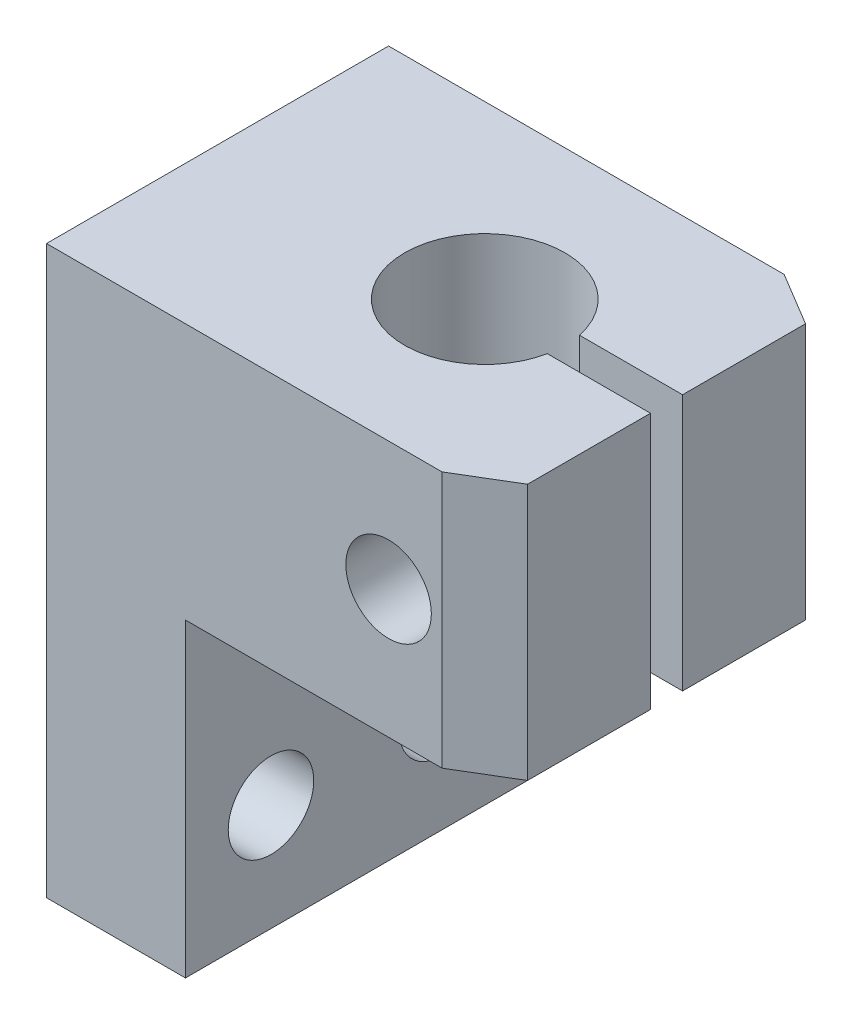
ISO-10303-21;
HEADER;
FILE_DESCRIPTION(('STEP AP214'),'2;1');
FILE_NAME('part.step','',(''),(''),'','','');
FILE_SCHEMA(('AUTOMOTIVE_DESIGN { 1 0 10303 214 1 1 1 1 }'));
ENDSEC;
DATA;
#1=APPLICATION_CONTEXT('core data for automotive mechanical design processes');
#2=APPLICATION_PROTOCOL_DEFINITION('international standard','automotive_design',2000,#1);
#3=PRODUCT_CONTEXT('',#1,'mechanical');
#4=PRODUCT('Part','Part','',(#3));
#5=PRODUCT_RELATED_PRODUCT_CATEGORY('part','',(#4));
#6=PRODUCT_DEFINITION_FORMATION('','',#4);
#7=PRODUCT_DEFINITION_CONTEXT('part definition',#1,'design');
#8=PRODUCT_DEFINITION('design','',#6,#7);
#9=PRODUCT_DEFINITION_SHAPE('','',#8);
#10=(LENGTH_UNIT() NAMED_UNIT(*) SI_UNIT(.MILLI.,.METRE.));
#11=(NAMED_UNIT(*) PLANE_ANGLE_UNIT() SI_UNIT($,.RADIAN.));
#12=(NAMED_UNIT(*) SI_UNIT($,.STERADIAN.) SOLID_ANGLE_UNIT());
#13=UNCERTAINTY_MEASURE_WITH_UNIT(LENGTH_MEASURE(1.E-05),#10,'distance_accuracy_value','');
#14=(GEOMETRIC_REPRESENTATION_CONTEXT(3) GLOBAL_UNCERTAINTY_ASSIGNED_CONTEXT((#13)) GLOBAL_UNIT_ASSIGNED_CONTEXT((#10,
#11,#12)) REPRESENTATION_CONTEXT('',''));
#15=CARTESIAN_POINT('',(0.,0.,0.));
#16=DIRECTION('',(0.,0.,1.));
#17=DIRECTION('',(1.,0.,0.));
#18=AXIS2_PLACEMENT_3D('',#15,#16,#17);
#19=CARTESIAN_POINT('',(42.,0.,32.));
#20=DIRECTION('',(1.,0.,0.));
#21=DIRECTION('',(0.,1.,0.));
#22=AXIS2_PLACEMENT_3D('',#19,#20,#21);
#23=PLANE('',#22);
#24=DIRECTION('',(0.,0.,-1.));
#25=VECTOR('',#24,1.);
#26=CARTESIAN_POINT('',(42.,-24.,32.));
#27=LINE('',#26,#25);
#28=CARTESIAN_POINT('',(42.,-24.,14.5));
#29=VERTEX_POINT('',#28);
#30=CARTESIAN_POINT('',(42.,-24.,3.00000000000002));
#31=VERTEX_POINT('',#30);
#32=EDGE_CURVE('E284',#29,#31,#27,.T.);
#33=ORIENTED_EDGE('',*,*,#32,.T.);
#34=DIRECTION('',(0.,1.,0.));
#35=VECTOR('',#34,1.);
#36=CARTESIAN_POINT('',(42.,0.,3.00000000000002));
#37=LINE('',#36,#35);
#38=CARTESIAN_POINT('',(42.,0.,3.00000000000002));
#39=VERTEX_POINT('',#38);
#40=EDGE_CURVE('E71',#31,#39,#37,.T.);
#41=ORIENTED_EDGE('',*,*,#40,.T.);
#42=DIRECTION('',(0.,0.,-1.));
#43=VECTOR('',#42,1.);
#44=CARTESIAN_POINT('',(42.,0.,32.));
#45=LINE('',#44,#43);
#46=CARTESIAN_POINT('',(42.,0.,14.5));
#47=VERTEX_POINT('',#46);
#48=EDGE_CURVE('E178',#47,#39,#45,.T.);
#49=ORIENTED_EDGE('',*,*,#48,.F.);
#50=DIRECTION('',(0.,-1.,0.));
#51=VECTOR('',#50,1.);
#52=CARTESIAN_POINT('',(42.,0.,14.5));
#53=LINE('',#52,#51);
#54=EDGE_CURVE('E211',#47,#29,#53,.T.);
#55=ORIENTED_EDGE('',*,*,#54,.T.);
#56=EDGE_LOOP('',(#33,#41,#49,#55));
#57=FACE_BOUND('',#56,.T.);
#58=ADVANCED_FACE('F61',(#57),#23,.T.);
#59=CARTESIAN_POINT('',(32.,-12.,32.));
#60=DIRECTION('',(0.,0.,-1.));
#61=DIRECTION('',(-1.,0.,0.));
#62=AXIS2_PLACEMENT_3D('',#59,#60,#61);
#63=CYLINDRICAL_SURFACE('',#62,4.00000000000001);
#64=CARTESIAN_POINT('',(32.,-12.,14.5));
#65=DIRECTION('',(0.,0.,-1.));
#66=DIRECTION('',(-1.,0.,0.));
#67=AXIS2_PLACEMENT_3D('',#64,#65,#66);
#68=CIRCLE('',#67,4.00000000000001);
#69=CARTESIAN_POINT('',(32.3484692283495,-8.01520775988339,14.5));
#70=VERTEX_POINT('',#69);
#71=CARTESIAN_POINT('',(32.3484692283495,-15.9847922401166,14.5));
#72=VERTEX_POINT('',#71);
#73=EDGE_CURVE('E381',#70,#72,#68,.T.);
#74=ORIENTED_EDGE('',*,*,#73,.F.);
#75=CARTESIAN_POINT('',(32.3484692283495,-15.9847922401166,14.5));
#76=CARTESIAN_POINT('',(32.3279476400915,-15.9865821315345,14.3994665723361));
#77=CARTESIAN_POINT('',(32.3053657332151,-15.9884024120403,14.2993666923016));
#78=CARTESIAN_POINT('',(32.2561134041222,-15.9918695870414,14.1001714854958));
#79=CARTESIAN_POINT('',(32.2294428496215,-15.9935164759238,14.0010761913375));
#80=CARTESIAN_POINT('',(32.1432959822248,-15.9978482435656,13.7053324938304));
#81=CARTESIAN_POINT('',(32.0777222026807,-15.9999200822324,13.5104111079246));
#82=CARTESIAN_POINT('',(31.9301397719995,-16.0000760764122,13.124907489344));
#83=CARTESIAN_POINT('',(31.8479895682176,-15.9981244518403,12.9343795587296));
#84=CARTESIAN_POINT('',(31.6682984929271,-15.9872385825846,12.5610099904932));
#85=CARTESIAN_POINT('',(31.5707676359628,-15.9783088665667,12.3781634488462));
#86=CARTESIAN_POINT('',(31.3916584924338,-15.9541804472491,12.0733880928686));
#87=CARTESIAN_POINT('',(31.3136403135395,-15.9415462288422,11.9491527724457));
#88=CARTESIAN_POINT('',(31.1508651239433,-15.9097120428309,11.7060222324002));
#89=CARTESIAN_POINT('',(31.0661082867479,-15.8905122442349,11.5871268754079));
#90=CARTESIAN_POINT('',(30.8909609053164,-15.8442426880015,11.3559146572445));
#91=CARTESIAN_POINT('',(30.8005946551388,-15.8172052294869,11.2435730258));
#92=CARTESIAN_POINT('',(30.6149430104995,-15.7538286794672,11.0257795233424));
#93=CARTESIAN_POINT('',(30.51965875391,-15.7174917319387,10.9203260712996));
#94=CARTESIAN_POINT('',(30.3452642721359,-15.6426545251765,10.7378049045736));
#95=CARTESIAN_POINT('',(30.2668001918166,-15.6060930093397,10.6593223787285));
#96=CARTESIAN_POINT('',(30.1084917940311,-15.5256313134716,10.507704058471));
#97=CARTESIAN_POINT('',(30.0286477910671,-15.4817327863696,10.4345670651045));
#98=CARTESIAN_POINT('',(29.8685642163748,-15.3861002552575,10.2940002628199));
#99=CARTESIAN_POINT('',(29.788324542329,-15.3343641092635,10.2265720219537));
#100=CARTESIAN_POINT('',(29.6286318043626,-15.2227473640042,10.0977724005209));
#101=CARTESIAN_POINT('',(29.5491787489496,-15.1628666767564,10.0364010853973));
#102=CARTESIAN_POINT('',(29.391823835788,-15.0344347958901,9.91957661339939));
#103=CARTESIAN_POINT('',(29.3139351810219,-14.9658304993785,9.86416390110497));
#104=CARTESIAN_POINT('',(29.1615804787105,-14.8203662458557,9.75982566325138));
#105=CARTESIAN_POINT('',(29.0871144982451,-14.7435061271395,9.71090026479973));
#106=CARTESIAN_POINT('',(28.9429508765934,-14.5818934420729,9.61952791628472));
#107=CARTESIAN_POINT('',(28.8732523896311,-14.497142281963,9.57707981546466));
#108=CARTESIAN_POINT('',(28.7398668727063,-14.3203004466739,9.49850858862854));
#109=CARTESIAN_POINT('',(28.6761792584055,-14.2282104865342,9.46238484750643));
#110=CARTESIAN_POINT('',(28.5625816862632,-14.0479794309192,9.39986813311078));
#111=CARTESIAN_POINT('',(28.5119269233741,-13.9605255512929,9.3728410833562));
#112=CARTESIAN_POINT('',(28.4169225160937,-13.7809754510231,9.32336075787554));
#113=CARTESIAN_POINT('',(28.3725750300503,-13.6888776557667,9.30090904669658));
#114=CARTESIAN_POINT('',(28.2908031611211,-13.5007901072137,9.26036366496484));
#115=CARTESIAN_POINT('',(28.2533754973961,-13.404802224748,9.24226792791412));
#116=CARTESIAN_POINT('',(28.1858666681025,-13.2095697781243,9.21018025127386));
#117=CARTESIAN_POINT('',(28.1557882439033,-13.1103240143417,9.1961898426395));
#118=CARTESIAN_POINT('',(28.1039861585091,-12.9117822983953,9.17240432716445));
#119=CARTESIAN_POINT('',(28.0820781571746,-12.8125455214018,9.16251600464993));
#120=CARTESIAN_POINT('',(28.0458442551581,-12.6123735833281,9.1462982574288));
#121=CARTESIAN_POINT('',(28.0315210847339,-12.5114378241483,9.1399701142036));
#122=CARTESIAN_POINT('',(28.0106236581338,-12.3086473590775,9.13077328055634));
#123=CARTESIAN_POINT('',(28.004046692872,-12.2067929870187,9.12790338067221));
#124=CARTESIAN_POINT('',(27.9986994331681,-12.0028029979972,9.12556836862707));
#125=CARTESIAN_POINT('',(27.9999320350765,-11.9006672907338,9.12610451967547));
#126=CARTESIAN_POINT('',(28.0102403127122,-11.696027884125,9.1306124535658));
#127=CARTESIAN_POINT('',(28.0193801895493,-11.5935280299697,9.13461235973973));
#128=CARTESIAN_POINT('',(28.0454976348554,-11.3896946788332,9.14615818027116));
#129=CARTESIAN_POINT('',(28.062478113179,-11.2883616292069,9.15370541115334));
#130=CARTESIAN_POINT('',(28.1040863365585,-11.0876656237564,9.17246985265354));
#131=CARTESIAN_POINT('',(28.1287109874344,-10.9883018880821,9.18368557845002));
#132=CARTESIAN_POINT('',(28.1853436136344,-10.7921839021378,9.20996610557116));
#133=CARTESIAN_POINT('',(28.2173542796494,-10.6954306172247,9.22503230982292));
#134=CARTESIAN_POINT('',(28.2883092554886,-10.5054764874334,9.25918647027361));
#135=CARTESIAN_POINT('',(28.3272379894529,-10.4122682217643,9.27826540924862));
#136=CARTESIAN_POINT('',(28.4115953074019,-10.2298368830611,9.32068516173467));
#137=CARTESIAN_POINT('',(28.4570262602754,-10.1406152780608,9.34402752935809));
#138=CARTESIAN_POINT('',(28.602201931666,-9.8800127344483,9.42078126730762));
#139=CARTESIAN_POINT('',(28.7109264541888,-9.71543833367862,9.48096334838627));
#140=CARTESIAN_POINT('',(28.9454529820933,-9.41029464234405,9.62020507186028));
#141=CARTESIAN_POINT('',(29.0711206564342,-9.26955441633084,9.69911960545421));
#142=CARTESIAN_POINT('',(29.3334137977663,-9.01286171227122,9.87655745136913));
#143=CARTESIAN_POINT('',(29.470040605079,-8.89691227255793,9.97508316436192));
#144=CARTESIAN_POINT('',(29.7521223875051,-8.68652213265695,10.1947965275146));
#145=CARTESIAN_POINT('',(29.8977187046296,-8.59298672331326,10.3166621909539));
#146=CARTESIAN_POINT('',(30.1862407042122,-8.43100968624096,10.5786647998982));
#147=CARTESIAN_POINT('',(30.3291662164998,-8.36256965232623,10.7188029051249));
#148=CARTESIAN_POINT('',(30.5690985129632,-8.26308934281292,10.9743635461632));
#149=CARTESIAN_POINT('',(30.6679992522649,-8.22693971751003,11.0861056000708));
#150=CARTESIAN_POINT('',(30.8601986595844,-8.16449967986145,11.3169858928861));
#151=CARTESIAN_POINT('',(30.9534951552781,-8.1382130701807,11.4361269638782));
#152=CARTESIAN_POINT('',(31.1337300622374,-8.09382111859771,11.6813628558948));
#153=CARTESIAN_POINT('',(31.2206389382708,-8.07575199416157,11.8074857638046));
#154=CARTESIAN_POINT('',(31.3868922993155,-8.04636562861496,12.0653895233106));
#155=CARTESIAN_POINT('',(31.4662349535431,-8.03505001817347,12.1971717331458));
#156=CARTESIAN_POINT('',(31.6365109240973,-8.01540070647246,12.5007964141958));
#157=CARTESIAN_POINT('',(31.7250381772559,-8.00862394990282,12.6740920772447));
#158=CARTESIAN_POINT('',(31.8884139135577,-8.00072021162165,13.027184068018));
#159=CARTESIAN_POINT('',(31.9632564489941,-7.99959568090533,13.2069831818257));
#160=CARTESIAN_POINT('',(32.098104528989,-8.00063962553631,13.5701698068444));
#161=CARTESIAN_POINT('',(32.1582410981558,-8.00277769151055,13.7535086455892));
#162=CARTESIAN_POINT('',(32.2376857127742,-8.00698084200948,14.0314497120808));
#163=CARTESIAN_POINT('',(32.2623678420135,-8.00854725562985,14.1245559734324));
#164=CARTESIAN_POINT('',(32.3081282379957,-8.01182028272979,14.3116477385582));
#165=CARTESIAN_POINT('',(32.3292064982884,-8.01352689646029,14.4056332439058));
#166=CARTESIAN_POINT('',(32.3484692283495,-8.01520775988339,14.5));
#167=B_SPLINE_CURVE_WITH_KNOTS('',3,(#75,#76,#77,#78,#79,#80,#81,#82,#83,#84,#85,#86,#87,#88,
#89,#90,#91,#92,#93,#94,#95,#96,#97,#98,#99,#100,#101,#102,#103,#104,#105,#106,#107,#108,#109,
#110,#111,#112,#113,#114,#115,#116,#117,#118,#119,#120,#121,#122,#123,#124,#125,#126,#127,#128,
#129,#130,#131,#132,#133,#134,#135,#136,#137,#138,#139,#140,#141,#142,#143,#144,#145,#146,#147,
#148,#149,#150,#151,#152,#153,#154,#155,#156,#157,#158,#159,#160,#161,#162,#163,#164,#165,#166),
.UNSPECIFIED.,.F.,.F.,(4,2,2,2,2,2,2,2,2,2,2,2,2,2,2,2,2,2,2,2,2,2,2,2,2,2,2,2,2,2,2,2,2,2,2,2,
2,2,2,2,2,2,2,2,2,4),(0.,0.307820468171958,0.615650897689144,1.23187610446544,1.85360494582323,
2.47493063020902,2.91631674026319,3.35769148920617,3.79727257347161,4.23675240445192,
4.58696116107485,4.93709112648953,5.28731695396195,5.63754656509442,5.99002049794918,
6.34250133589125,6.69491947899599,7.0473033269127,7.36076758516049,7.67433885400046,
7.98776106843954,8.30130001588611,8.60726177200562,8.91333358827266,9.21929833000608,
9.52537655216129,9.83396347265568,10.1426650100831,10.451241755009,10.7599310909813,
11.0679340281398,11.376049463949,11.9914599453893,12.6022504350502,13.2131157397059,
13.8455764463206,14.4780773137266,14.9381073417984,15.3983145516744,15.8605308608102,
16.3228587292312,16.9062612747948,17.489916781509,18.0681653974279,18.3571091180333,
18.6460533557904),.UNSPECIFIED.);
#168=EDGE_CURVE('E221',#72,#70,#167,.T.);
#169=ORIENTED_EDGE('',*,*,#168,.F.);
#170=EDGE_LOOP('',(#74,#169));
#171=FACE_BOUND('',#170,.T.);
#172=CARTESIAN_POINT('',(32.,-12.,0.));
#173=DIRECTION('',(0.,0.,1.));
#174=DIRECTION('',(1.,0.,0.));
#175=AXIS2_PLACEMENT_3D('',#172,#173,#174);
#176=CIRCLE('',#175,4.00000000000001);
#177=CARTESIAN_POINT('',(36.,-12.,0.));
#178=VERTEX_POINT('',#177);
#179=EDGE_CURVE('E314',#178,#178,#176,.T.);
#180=ORIENTED_EDGE('',*,*,#179,.F.);
#181=EDGE_LOOP('',(#180));
#182=FACE_BOUND('',#181,.T.);
#183=ADVANCED_FACE('F274',(#171,#182),#63,.F.);
#184=CARTESIAN_POINT('',(42.,0.,29.));
#185=VERTEX_POINT('',#184);
#186=CARTESIAN_POINT('',(42.,0.,17.5));
#187=VERTEX_POINT('',#186);
#188=EDGE_CURVE('E164',#185,#187,#45,.T.);
#189=ORIENTED_EDGE('',*,*,#188,.F.);
#190=DIRECTION('',(0.,-1.,0.));
#191=VECTOR('',#190,1.);
#192=CARTESIAN_POINT('',(42.,0.,29.));
#193=LINE('',#192,#191);
#194=CARTESIAN_POINT('',(42.,-24.,29.));
#195=VERTEX_POINT('',#194);
#196=EDGE_CURVE('E177',#185,#195,#193,.T.);
#197=ORIENTED_EDGE('',*,*,#196,.T.);
#198=CARTESIAN_POINT('',(42.,-24.,17.5));
#199=VERTEX_POINT('',#198);
#200=EDGE_CURVE('E195',#195,#199,#27,.T.);
#201=ORIENTED_EDGE('',*,*,#200,.T.);
#202=DIRECTION('',(0.,-1.,0.));
#203=VECTOR('',#202,1.);
#204=CARTESIAN_POINT('',(42.,0.,17.5));
#205=LINE('',#204,#203);
#206=EDGE_CURVE('E184',#187,#199,#205,.T.);
#207=ORIENTED_EDGE('',*,*,#206,.F.);
#208=EDGE_LOOP('',(#189,#197,#201,#207));
#209=FACE_BOUND('',#208,.T.);
#210=ADVANCED_FACE('F193',(#209),#23,.T.);
#211=CARTESIAN_POINT('',(0.,0.,32.));
#212=DIRECTION('',(0.,1.,0.));
#213=DIRECTION('',(0.,0.,1.));
#214=AXIS2_PLACEMENT_3D('',#211,#212,#213);
#215=PLANE('',#214);
#216=ORIENTED_EDGE('',*,*,#48,.T.);
#217=DIRECTION('',(-0.857492925712544,0.,-0.514495755427527));
#218=VECTOR('',#217,1.);
#219=CARTESIAN_POINT('',(23.9117647058824,0.,-7.85294117647058));
#220=LINE('',#219,#218);
#221=CARTESIAN_POINT('',(37.,0.,0.));
#222=VERTEX_POINT('',#221);
#223=EDGE_CURVE('E13',#39,#222,#220,.T.);
#224=ORIENTED_EDGE('',*,*,#223,.T.);
#225=DIRECTION('',(1.,0.,0.));
#226=VECTOR('',#225,1.);
#227=CARTESIAN_POINT('',(0.,0.,0.));
#228=LINE('',#227,#226);
#229=CARTESIAN_POINT('',(0.,0.,0.));
#230=VERTEX_POINT('',#229);
#231=EDGE_CURVE('E350',#230,#222,#228,.T.);
#232=ORIENTED_EDGE('',*,*,#231,.F.);
#233=DIRECTION('',(0.,0.,-1.));
#234=VECTOR('',#233,1.);
#235=CARTESIAN_POINT('',(0.,0.,32.));
#236=LINE('',#235,#234);
#237=CARTESIAN_POINT('',(0.,0.,32.));
#238=VERTEX_POINT('',#237);
#239=EDGE_CURVE('E320',#238,#230,#236,.T.);
#240=ORIENTED_EDGE('',*,*,#239,.F.);
#241=DIRECTION('',(1.,0.,0.));
#242=VECTOR('',#241,1.);
#243=CARTESIAN_POINT('',(0.,0.,32.));
#244=LINE('',#243,#242);
#245=CARTESIAN_POINT('',(37.,0.,32.));
#246=VERTEX_POINT('',#245);
#247=EDGE_CURVE('E371',#238,#246,#244,.T.);
#248=ORIENTED_EDGE('',*,*,#247,.T.);
#249=DIRECTION('',(-0.857492925712545,0.,0.514495755427525));
#250=VECTOR('',#249,1.);
#251=CARTESIAN_POINT('',(9.79411764705877,0.,48.3235294117647));
#252=LINE('',#251,#250);
#253=EDGE_CURVE('E171',#246,#185,#252,.F.);
#254=ORIENTED_EDGE('',*,*,#253,.T.);
#255=ORIENTED_EDGE('',*,*,#188,.T.);
#256=DIRECTION('',(-1.,0.,0.));
#257=VECTOR('',#256,1.);
#258=CARTESIAN_POINT('',(32.3484692283495,0.,17.5));
#259=LINE('',#258,#257);
#260=CARTESIAN_POINT('',(32.3484692283495,0.,17.5));
#261=VERTEX_POINT('',#260);
#262=EDGE_CURVE('E168',#187,#261,#259,.T.);
#263=ORIENTED_EDGE('',*,*,#262,.T.);
#264=CARTESIAN_POINT('',(25.,0.,16.));
#265=DIRECTION('',(0.,-1.,0.));
#266=DIRECTION('',(0.,0.,-1.));
#267=AXIS2_PLACEMENT_3D('',#264,#265,#266);
#268=CIRCLE('',#267,7.5);
#269=CARTESIAN_POINT('',(32.3484692283495,0.,14.5));
#270=VERTEX_POINT('',#269);
#271=EDGE_CURVE('E190',#261,#270,#268,.T.);
#272=ORIENTED_EDGE('',*,*,#271,.T.);
#273=DIRECTION('',(1.,0.,0.));
#274=VECTOR('',#273,1.);
#275=CARTESIAN_POINT('',(32.3484692283495,0.,14.5));
#276=LINE('',#275,#274);
#277=EDGE_CURVE('E198',#270,#47,#276,.T.);
#278=ORIENTED_EDGE('',*,*,#277,.T.);
#279=EDGE_LOOP('',(#216,#224,#232,#240,#248,#254,#255,#263,#272,#278));
#280=FACE_BOUND('',#279,.T.);
#281=ADVANCED_FACE('F166',(#280),#215,.T.);
#282=CARTESIAN_POINT('',(0.,0.,32.));
#283=DIRECTION('',(1.,0.,0.));
#284=DIRECTION('',(0.,0.,-1.));
#285=AXIS2_PLACEMENT_3D('',#282,#283,#284);
#286=PLANE('',#285);
#287=CARTESIAN_POINT('',(0.,-43.,8.));
#288=DIRECTION('',(-1.,0.,0.));
#289=DIRECTION('',(0.,0.,1.));
#290=AXIS2_PLACEMENT_3D('',#287,#288,#289);
#291=CIRCLE('',#290,4.);
#292=CARTESIAN_POINT('',(0.,-43.,12.));
#293=VERTEX_POINT('',#292);
#294=EDGE_CURVE('E318',#293,#293,#291,.T.);
#295=ORIENTED_EDGE('',*,*,#294,.F.);
#296=EDGE_LOOP('',(#295));
#297=FACE_BOUND('',#296,.T.);
#298=CARTESIAN_POINT('',(0.,-43.,24.));
#299=DIRECTION('',(-1.,0.,0.));
#300=DIRECTION('',(0.,0.,1.));
#301=AXIS2_PLACEMENT_3D('',#298,#299,#300);
#302=CIRCLE('',#301,4.00000000000001);
#303=CARTESIAN_POINT('',(0.,-43.,28.));
#304=VERTEX_POINT('',#303);
#305=EDGE_CURVE('E377',#304,#304,#302,.T.);
#306=ORIENTED_EDGE('',*,*,#305,.F.);
#307=EDGE_LOOP('',(#306));
#308=FACE_BOUND('',#307,.T.);
#309=DIRECTION('',(0.,-1.,0.));
#310=VECTOR('',#309,1.);
#311=CARTESIAN_POINT('',(0.,0.,0.));
#312=LINE('',#311,#310);
#313=CARTESIAN_POINT('',(0.,-53.,0.));
#314=VERTEX_POINT('',#313);
#315=EDGE_CURVE('E346',#230,#314,#312,.T.);
#316=ORIENTED_EDGE('',*,*,#315,.T.);
#317=DIRECTION('',(0.,0.,-1.));
#318=VECTOR('',#317,1.);
#319=CARTESIAN_POINT('',(0.,-53.,32.));
#320=LINE('',#319,#318);
#321=CARTESIAN_POINT('',(0.,-53.,32.));
#322=VERTEX_POINT('',#321);
#323=EDGE_CURVE('E323',#322,#314,#320,.T.);
#324=ORIENTED_EDGE('',*,*,#323,.F.);
#325=DIRECTION('',(0.,-1.,0.));
#326=VECTOR('',#325,1.);
#327=CARTESIAN_POINT('',(0.,0.,32.));
#328=LINE('',#327,#326);
#329=EDGE_CURVE('E367',#238,#322,#328,.T.);
#330=ORIENTED_EDGE('',*,*,#329,.F.);
#331=ORIENTED_EDGE('',*,*,#239,.T.);
#332=EDGE_LOOP('',(#316,#324,#330,#331));
#333=FACE_BOUND('',#332,.T.);
#334=ADVANCED_FACE('F267',(#297,#308,#333),#286,.F.);
#335=CARTESIAN_POINT('',(0.,-53.,32.));
#336=DIRECTION('',(0.,1.,0.));
#337=DIRECTION('',(0.,0.,1.));
#338=AXIS2_PLACEMENT_3D('',#335,#336,#337);
#339=PLANE('',#338);
#340=DIRECTION('',(1.,0.,0.));
#341=VECTOR('',#340,1.);
#342=CARTESIAN_POINT('',(0.,-53.,0.));
#343=LINE('',#342,#341);
#344=CARTESIAN_POINT('',(13.,-53.,0.));
#345=VERTEX_POINT('',#344);
#346=EDGE_CURVE('E342',#314,#345,#343,.T.);
#347=ORIENTED_EDGE('',*,*,#346,.T.);
#348=DIRECTION('',(0.,0.,-1.));
#349=VECTOR('',#348,1.);
#350=CARTESIAN_POINT('',(13.,-53.,32.));
#351=LINE('',#350,#349);
#352=CARTESIAN_POINT('',(13.,-53.,32.));
#353=VERTEX_POINT('',#352);
#354=EDGE_CURVE('E327',#353,#345,#351,.T.);
#355=ORIENTED_EDGE('',*,*,#354,.F.);
#356=DIRECTION('',(1.,0.,0.));
#357=VECTOR('',#356,1.);
#358=CARTESIAN_POINT('',(0.,-53.,32.));
#359=LINE('',#358,#357);
#360=EDGE_CURVE('E364',#322,#353,#359,.T.);
#361=ORIENTED_EDGE('',*,*,#360,.F.);
#362=ORIENTED_EDGE('',*,*,#323,.T.);
#363=EDGE_LOOP('',(#347,#355,#361,#362));
#364=FACE_BOUND('',#363,.T.);
#365=ADVANCED_FACE('F263',(#364),#339,.F.);
#366=CARTESIAN_POINT('',(13.,0.,32.));
#367=DIRECTION('',(1.,0.,0.));
#368=DIRECTION('',(0.,1.,0.));
#369=AXIS2_PLACEMENT_3D('',#366,#367,#368);
#370=PLANE('',#369);
#371=CARTESIAN_POINT('',(13.,-43.,8.));
#372=DIRECTION('',(1.,0.,0.));
#373=DIRECTION('',(0.,1.,0.));
#374=AXIS2_PLACEMENT_3D('',#371,#372,#373);
#375=CIRCLE('',#374,4.);
#376=CARTESIAN_POINT('',(13.,-39.,8.));
#377=VERTEX_POINT('',#376);
#378=EDGE_CURVE('E310',#377,#377,#375,.T.);
#379=ORIENTED_EDGE('',*,*,#378,.F.);
#380=EDGE_LOOP('',(#379));
#381=FACE_BOUND('',#380,.T.);
#382=CARTESIAN_POINT('',(13.,-43.,24.));
#383=DIRECTION('',(1.,0.,0.));
#384=DIRECTION('',(0.,1.,0.));
#385=AXIS2_PLACEMENT_3D('',#382,#383,#384);
#386=CIRCLE('',#385,4.00000000000001);
#387=CARTESIAN_POINT('',(13.,-39.,24.));
#388=VERTEX_POINT('',#387);
#389=EDGE_CURVE('E315',#388,#388,#386,.T.);
#390=ORIENTED_EDGE('',*,*,#389,.F.);
#391=EDGE_LOOP('',(#390));
#392=FACE_BOUND('',#391,.T.);
#393=DIRECTION('',(0.,-1.,0.));
#394=VECTOR('',#393,1.);
#395=CARTESIAN_POINT('',(13.,0.,0.));
#396=LINE('',#395,#394);
#397=CARTESIAN_POINT('',(13.,-24.,0.));
#398=VERTEX_POINT('',#397);
#399=EDGE_CURVE('E338',#398,#345,#396,.T.);
#400=ORIENTED_EDGE('',*,*,#399,.F.);
#401=DIRECTION('',(0.,0.,-1.));
#402=VECTOR('',#401,1.);
#403=CARTESIAN_POINT('',(13.,-24.,32.));
#404=LINE('',#403,#402);
#405=CARTESIAN_POINT('',(13.,-24.,32.));
#406=VERTEX_POINT('',#405);
#407=EDGE_CURVE('E330',#406,#398,#404,.T.);
#408=ORIENTED_EDGE('',*,*,#407,.F.);
#409=DIRECTION('',(0.,-1.,0.));
#410=VECTOR('',#409,1.);
#411=CARTESIAN_POINT('',(13.,0.,32.));
#412=LINE('',#411,#410);
#413=EDGE_CURVE('E360',#406,#353,#412,.T.);
#414=ORIENTED_EDGE('',*,*,#413,.T.);
#415=ORIENTED_EDGE('',*,*,#354,.T.);
#416=EDGE_LOOP('',(#400,#408,#414,#415));
#417=FACE_BOUND('',#416,.T.);
#418=ADVANCED_FACE('F260',(#381,#392,#417),#370,.T.);
#419=CARTESIAN_POINT('',(32.3484692283495,-8.01520775988339,17.5));
#420=CARTESIAN_POINT('',(32.3279476400915,-8.01341786846555,17.6005334276639));
#421=CARTESIAN_POINT('',(32.3053657332151,-8.01159758795969,17.7006333076984));
#422=CARTESIAN_POINT('',(32.2561134041222,-8.00813041295862,17.8998285145042));
#423=CARTESIAN_POINT('',(32.2294428496215,-8.00648352407624,17.9989238086625));
#424=CARTESIAN_POINT('',(32.1432959822248,-8.0021517564344,18.2946675061696));
#425=CARTESIAN_POINT('',(32.0777222026807,-8.00007991776764,18.4895888920753));
#426=CARTESIAN_POINT('',(31.9301397719995,-7.9999239235878,18.875092510656));
#427=CARTESIAN_POINT('',(31.8479895682176,-8.00187554815969,19.0656204412704));
#428=CARTESIAN_POINT('',(31.6682984929271,-8.01276141741536,19.4389900095068));
#429=CARTESIAN_POINT('',(31.5707676359628,-8.02169113343327,19.6218365511538));
#430=CARTESIAN_POINT('',(31.3916584924338,-8.04581955275092,19.9266119071314));
#431=CARTESIAN_POINT('',(31.3136403135396,-8.05845377115783,20.0508472275543));
#432=CARTESIAN_POINT('',(31.1508651239433,-8.09028795716906,20.2939777675998));
#433=CARTESIAN_POINT('',(31.0661082867479,-8.10948775576512,20.4128731245921));
#434=CARTESIAN_POINT('',(30.8909609053164,-8.15575731199849,20.6440853427555));
#435=CARTESIAN_POINT('',(30.8005946551388,-8.18279477051312,20.7564269742));
#436=CARTESIAN_POINT('',(30.6149430104995,-8.24617132053275,20.9742204766576));
#437=CARTESIAN_POINT('',(30.51965875391,-8.28250826806132,21.0796739287004));
#438=CARTESIAN_POINT('',(30.3452642721359,-8.35734547482353,21.2621950954264));
#439=CARTESIAN_POINT('',(30.2668001918166,-8.39390699066031,21.3406776212715));
#440=CARTESIAN_POINT('',(30.1084917940311,-8.47436868652844,21.492295941529));
#441=CARTESIAN_POINT('',(30.0286477910671,-8.51826721363043,21.5654329348955));
#442=CARTESIAN_POINT('',(29.8685642163748,-8.61389974474249,21.7059997371801));
#443=CARTESIAN_POINT('',(29.788324542329,-8.66563589073653,21.7734279780463));
#444=CARTESIAN_POINT('',(29.6286318043626,-8.77725263599583,21.9022275994791));
#445=CARTESIAN_POINT('',(29.5491787489496,-8.83713332324356,21.9635989146027));
#446=CARTESIAN_POINT('',(29.391823835788,-8.96556520410989,22.0804233866006));
#447=CARTESIAN_POINT('',(29.3139351810219,-9.03416950062147,22.135836098895));
#448=CARTESIAN_POINT('',(29.1615804787105,-9.17963375414429,22.2401743367486));
#449=CARTESIAN_POINT('',(29.0871144982451,-9.25649387286046,22.2890997352003));
#450=CARTESIAN_POINT('',(28.9429508765934,-9.41810655792705,22.3804720837153));
#451=CARTESIAN_POINT('',(28.8732523896311,-9.502857718037,22.4229201845353));
#452=CARTESIAN_POINT('',(28.7398668727063,-9.67969955332613,22.5014914113715));
#453=CARTESIAN_POINT('',(28.6761792584055,-9.77178951346578,22.5376151524936));
#454=CARTESIAN_POINT('',(28.5625816862632,-9.95202056908084,22.6001318668892));
#455=CARTESIAN_POINT('',(28.5119269233741,-10.0394744487071,22.6271589166438));
#456=CARTESIAN_POINT('',(28.4169225160937,-10.2190245489769,22.6766392421245));
#457=CARTESIAN_POINT('',(28.3725750300503,-10.3111223442333,22.6990909533034));
#458=CARTESIAN_POINT('',(28.2908031611211,-10.4992098927863,22.7396363350352));
#459=CARTESIAN_POINT('',(28.2533754973961,-10.595197775252,22.7577320720859));
#460=CARTESIAN_POINT('',(28.1858666681025,-10.7904302218757,22.7898197487261));
#461=CARTESIAN_POINT('',(28.1557882439033,-10.8896759856583,22.8038101573605));
#462=CARTESIAN_POINT('',(28.1039861585091,-11.0882177016047,22.8275956728355));
#463=CARTESIAN_POINT('',(28.0820781571746,-11.1874544785982,22.8374839953501));
#464=CARTESIAN_POINT('',(28.0458442551581,-11.3876264166719,22.8537017425712));
#465=CARTESIAN_POINT('',(28.0315210847339,-11.4885621758516,22.8600298857964));
#466=CARTESIAN_POINT('',(28.0106236581338,-11.6913526409225,22.8692267194437));
#467=CARTESIAN_POINT('',(28.004046692872,-11.7932070129813,22.8720966193278));
#468=CARTESIAN_POINT('',(27.9986994331681,-11.9971970020028,22.8744316313729));
#469=CARTESIAN_POINT('',(27.9999320350765,-12.0993327092662,22.8738954803245));
#470=CARTESIAN_POINT('',(28.0102403127122,-12.303972115875,22.8693875464342));
#471=CARTESIAN_POINT('',(28.0193801895493,-12.4064719700303,22.8653876402603));
#472=CARTESIAN_POINT('',(28.0454976348554,-12.6103053211668,22.8538418197288));
#473=CARTESIAN_POINT('',(28.062478113179,-12.7116383707931,22.8462945888467));
#474=CARTESIAN_POINT('',(28.1040863365585,-12.9123343762436,22.8275301473465));
#475=CARTESIAN_POINT('',(28.1287109874344,-13.0116981119179,22.81631442155));
#476=CARTESIAN_POINT('',(28.1853436136344,-13.2078160978622,22.7900338944288));
#477=CARTESIAN_POINT('',(28.2173542796494,-13.3045693827753,22.7749676901771));
#478=CARTESIAN_POINT('',(28.2883092554886,-13.4945235125666,22.7408135297264));
#479=CARTESIAN_POINT('',(28.3272379894529,-13.5877317782357,22.7217345907514));
#480=CARTESIAN_POINT('',(28.4115953074019,-13.7701631169389,22.6793148382653));
#481=CARTESIAN_POINT('',(28.4570262602754,-13.8593847219392,22.6559724706419));
#482=CARTESIAN_POINT('',(28.602201931666,-14.1199872655517,22.5792187326924));
#483=CARTESIAN_POINT('',(28.7109264541888,-14.2845616663214,22.5190366516137));
#484=CARTESIAN_POINT('',(28.9454529820933,-14.5897053576559,22.3797949281397));
#485=CARTESIAN_POINT('',(29.0711206564342,-14.7304455836692,22.3008803945458));
#486=CARTESIAN_POINT('',(29.3334137977663,-14.9871382877288,22.1234425486309));
#487=CARTESIAN_POINT('',(29.470040605079,-15.1030877274421,22.0249168356381));
#488=CARTESIAN_POINT('',(29.7521223875051,-15.313477867343,21.8052034724854));
#489=CARTESIAN_POINT('',(29.8977187046296,-15.4070132766867,21.6833378090461));
#490=CARTESIAN_POINT('',(30.1862407042122,-15.568990313759,21.4213352001018));
#491=CARTESIAN_POINT('',(30.3291662164998,-15.6374303476738,21.2811970948751));
#492=CARTESIAN_POINT('',(30.5690985129632,-15.7369106571871,21.0256364538368));
#493=CARTESIAN_POINT('',(30.6679992522649,-15.77306028249,20.9138943999292));
#494=CARTESIAN_POINT('',(30.8601986595844,-15.8355003201386,20.6830141071139));
#495=CARTESIAN_POINT('',(30.9534951552781,-15.8617869298193,20.5638730361218));
#496=CARTESIAN_POINT('',(31.1337300622374,-15.9061788814023,20.3186371441052));
#497=CARTESIAN_POINT('',(31.2206389382708,-15.9242480058384,20.1925142361954));
#498=CARTESIAN_POINT('',(31.3868922993155,-15.953634371385,19.9346104766894));
#499=CARTESIAN_POINT('',(31.4662349535431,-15.9649499818265,19.8028282668542));
#500=CARTESIAN_POINT('',(31.6365109240973,-15.9845992935275,19.4992035858042));
#501=CARTESIAN_POINT('',(31.7250381772559,-15.9913760500972,19.3259079227553));
#502=CARTESIAN_POINT('',(31.8884139135577,-15.9992797883784,18.972815931982));
#503=CARTESIAN_POINT('',(31.963256448994,-16.0004043190947,18.7930168181743));
#504=CARTESIAN_POINT('',(32.098104528989,-15.9993603744637,18.4298301931556));
#505=CARTESIAN_POINT('',(32.1582410981558,-15.9972223084894,18.2464913544108));
#506=CARTESIAN_POINT('',(32.2376857127742,-15.9930191579905,17.9685502879192));
#507=CARTESIAN_POINT('',(32.2623678420135,-15.9914527443701,17.8754440265676));
#508=CARTESIAN_POINT('',(32.3081282379957,-15.9881797172702,17.6883522614418));
#509=CARTESIAN_POINT('',(32.3292064982884,-15.9864731035397,17.5943667560942));
#510=CARTESIAN_POINT('',(32.3484692283495,-15.9847922401166,17.5));
#511=B_SPLINE_CURVE_WITH_KNOTS('',3,(#419,#420,#421,#422,#423,#424,#425,#426,#427,#428,#429,
#430,#431,#432,#433,#434,#435,#436,#437,#438,#439,#440,#441,#442,#443,#444,#445,#446,#447,#448,
#449,#450,#451,#452,#453,#454,#455,#456,#457,#458,#459,#460,#461,#462,#463,#464,#465,#466,#467,
#468,#469,#470,#471,#472,#473,#474,#475,#476,#477,#478,#479,#480,#481,#482,#483,#484,#485,#486,
#487,#488,#489,#490,#491,#492,#493,#494,#495,#496,#497,#498,#499,#500,#501,#502,#503,#504,#505,
#506,#507,#508,#509,#510),.UNSPECIFIED.,.F.,.F.,(4,2,2,2,2,2,2,2,2,2,2,2,2,2,2,2,2,2,2,2,2,2,2,
2,2,2,2,2,2,2,2,2,2,2,2,2,2,2,2,2,2,2,2,2,2,4),(0.,0.307820468171958,0.615650897689146,
1.23187610446543,1.85360494582324,2.47493063020902,2.91631674026319,3.35769148920617,
3.79727257347161,4.23675240445193,4.58696116107485,4.93709112648953,5.28731695396195,
5.63754656509442,5.99002049794918,6.34250133589125,6.69491947899599,7.0473033269127,
7.36076758516049,7.67433885400046,7.98776106843954,8.30130001588611,8.60726177200562,
8.91333358827266,9.21929833000608,9.5253765521613,9.83396347265568,10.1426650100831,
10.451241755009,10.7599310909813,11.0679340281398,11.376049463949,11.9914599453893,
12.6022504350502,13.2131157397059,13.8455764463206,14.4780773137266,14.9381073417984,
15.3983145516744,15.8605308608102,16.3228587292312,16.9062612747948,17.489916781509,
18.068165397428,18.3571091180333,18.6460533557904),.UNSPECIFIED.);
#512=CARTESIAN_POINT('',(32.3484692283495,-8.01520775988339,17.5));
#513=VERTEX_POINT('',#512);
#514=CARTESIAN_POINT('',(32.3484692283495,-15.9847922401166,17.5));
#515=VERTEX_POINT('',#514);
#516=EDGE_CURVE('E210',#513,#515,#511,.T.);
#517=ORIENTED_EDGE('',*,*,#516,.F.);
#518=CARTESIAN_POINT('',(32.,-12.,17.5));
#519=DIRECTION('',(0.,0.,1.));
#520=DIRECTION('',(1.,0.,0.));
#521=AXIS2_PLACEMENT_3D('',#518,#519,#520);
#522=CIRCLE('',#521,4.00000000000001);
#523=EDGE_CURVE('E207',#515,#513,#522,.T.);
#524=ORIENTED_EDGE('',*,*,#523,.F.);
#525=EDGE_LOOP('',(#517,#524));
#526=FACE_BOUND('',#525,.T.);
#527=CARTESIAN_POINT('',(32.,-12.,32.));
#528=DIRECTION('',(0.,0.,1.));
#529=DIRECTION('',(1.,0.,0.));
#530=AXIS2_PLACEMENT_3D('',#527,#528,#529);
#531=CIRCLE('',#530,4.00000000000001);
#532=CARTESIAN_POINT('',(36.,-12.,32.));
#533=VERTEX_POINT('',#532);
#534=EDGE_CURVE('E337',#533,#533,#531,.T.);
#535=ORIENTED_EDGE('',*,*,#534,.T.);
#536=EDGE_LOOP('',(#535));
#537=FACE_BOUND('',#536,.T.);
#538=ADVANCED_FACE('F227',(#526,#537),#63,.F.);
#539=CARTESIAN_POINT('',(0.,-24.,32.));
#540=DIRECTION('',(0.,1.,0.));
#541=DIRECTION('',(0.,0.,1.));
#542=AXIS2_PLACEMENT_3D('',#539,#540,#541);
#543=PLANE('',#542);
#544=DIRECTION('',(1.,0.,0.));
#545=VECTOR('',#544,1.);
#546=CARTESIAN_POINT('',(0.,-24.,0.));
#547=LINE('',#546,#545);
#548=CARTESIAN_POINT('',(37.,-24.,0.));
#549=VERTEX_POINT('',#548);
#550=EDGE_CURVE('E334',#398,#549,#547,.T.);
#551=ORIENTED_EDGE('',*,*,#550,.T.);
#552=DIRECTION('',(0.857492925712544,0.,0.514495755427527));
#553=VECTOR('',#552,1.);
#554=CARTESIAN_POINT('',(37.,-24.,0.));
#555=LINE('',#554,#553);
#556=EDGE_CURVE('E85',#549,#31,#555,.T.);
#557=ORIENTED_EDGE('',*,*,#556,.T.);
#558=ORIENTED_EDGE('',*,*,#32,.F.);
#559=DIRECTION('',(1.,0.,0.));
#560=VECTOR('',#559,1.);
#561=CARTESIAN_POINT('',(32.3484692283495,-24.,14.5));
#562=LINE('',#561,#560);
#563=CARTESIAN_POINT('',(32.3484692283495,-24.,14.5));
#564=VERTEX_POINT('',#563);
#565=EDGE_CURVE('E191',#564,#29,#562,.T.);
#566=ORIENTED_EDGE('',*,*,#565,.F.);
#567=CARTESIAN_POINT('',(25.,-24.,16.));
#568=DIRECTION('',(0.,-1.,0.));
#569=DIRECTION('',(0.,0.,-1.));
#570=AXIS2_PLACEMENT_3D('',#567,#568,#569);
#571=CIRCLE('',#570,7.5);
#572=CARTESIAN_POINT('',(32.3484692283495,-24.,17.5));
#573=VERTEX_POINT('',#572);
#574=EDGE_CURVE('E410',#573,#564,#571,.T.);
#575=ORIENTED_EDGE('',*,*,#574,.F.);
#576=DIRECTION('',(-1.,0.,0.));
#577=VECTOR('',#576,1.);
#578=CARTESIAN_POINT('',(32.3484692283495,-24.,17.5));
#579=LINE('',#578,#577);
#580=EDGE_CURVE('E407',#199,#573,#579,.T.);
#581=ORIENTED_EDGE('',*,*,#580,.F.);
#582=ORIENTED_EDGE('',*,*,#200,.F.);
#583=DIRECTION('',(0.857492925712545,0.,-0.514495755427525));
#584=VECTOR('',#583,1.);
#585=CARTESIAN_POINT('',(42.,-24.,29.));
#586=LINE('',#585,#584);
#587=CARTESIAN_POINT('',(37.,-24.,32.));
#588=VERTEX_POINT('',#587);
#589=EDGE_CURVE('E305',#195,#588,#586,.F.);
#590=ORIENTED_EDGE('',*,*,#589,.T.);
#591=DIRECTION('',(1.,0.,0.));
#592=VECTOR('',#591,1.);
#593=CARTESIAN_POINT('',(0.,-24.,32.));
#594=LINE('',#593,#592);
#595=EDGE_CURVE('E287',#406,#588,#594,.T.);
#596=ORIENTED_EDGE('',*,*,#595,.F.);
#597=ORIENTED_EDGE('',*,*,#407,.T.);
#598=EDGE_LOOP('',(#551,#557,#558,#566,#575,#581,#582,#590,#596,#597));
#599=FACE_BOUND('',#598,.T.);
#600=ADVANCED_FACE('F253',(#599),#543,.F.);
#601=CARTESIAN_POINT('',(0.,0.,32.));
#602=DIRECTION('',(0.,0.,1.));
#603=DIRECTION('',(1.,0.,0.));
#604=AXIS2_PLACEMENT_3D('',#601,#602,#603);
#605=PLANE('',#604);
#606=ORIENTED_EDGE('',*,*,#534,.F.);
#607=EDGE_LOOP('',(#606));
#608=FACE_BOUND('',#607,.T.);
#609=ORIENTED_EDGE('',*,*,#595,.T.);
#610=DIRECTION('',(0.,1.,0.));
#611=VECTOR('',#610,1.);
#612=CARTESIAN_POINT('',(37.,0.,32.));
#613=LINE('',#612,#611);
#614=EDGE_CURVE('E302',#588,#246,#613,.T.);
#615=ORIENTED_EDGE('',*,*,#614,.T.);
#616=ORIENTED_EDGE('',*,*,#247,.F.);
#617=ORIENTED_EDGE('',*,*,#329,.T.);
#618=ORIENTED_EDGE('',*,*,#360,.T.);
#619=ORIENTED_EDGE('',*,*,#413,.F.);
#620=EDGE_LOOP('',(#609,#615,#616,#617,#618,#619));
#621=FACE_BOUND('',#620,.T.);
#622=ADVANCED_FACE('F250',(#608,#621),#605,.T.);
#623=CARTESIAN_POINT('',(0.,0.,0.));
#624=DIRECTION('',(0.,0.,1.));
#625=DIRECTION('',(1.,0.,0.));
#626=AXIS2_PLACEMENT_3D('',#623,#624,#625);
#627=PLANE('',#626);
#628=ORIENTED_EDGE('',*,*,#179,.T.);
#629=EDGE_LOOP('',(#628));
#630=FACE_BOUND('',#629,.T.);
#631=ORIENTED_EDGE('',*,*,#231,.T.);
#632=DIRECTION('',(0.,-1.,0.));
#633=VECTOR('',#632,1.);
#634=CARTESIAN_POINT('',(37.,-24.,0.));
#635=LINE('',#634,#633);
#636=EDGE_CURVE('E295',#222,#549,#635,.T.);
#637=ORIENTED_EDGE('',*,*,#636,.T.);
#638=ORIENTED_EDGE('',*,*,#550,.F.);
#639=ORIENTED_EDGE('',*,*,#399,.T.);
#640=ORIENTED_EDGE('',*,*,#346,.F.);
#641=ORIENTED_EDGE('',*,*,#315,.F.);
#642=EDGE_LOOP('',(#631,#637,#638,#639,#640,#641));
#643=FACE_BOUND('',#642,.T.);
#644=ADVANCED_FACE('F248',(#630,#643),#627,.F.);
#645=CARTESIAN_POINT('',(42.,-43.,24.));
#646=DIRECTION('',(-1.,0.,0.));
#647=DIRECTION('',(0.,0.,1.));
#648=AXIS2_PLACEMENT_3D('',#645,#646,#647);
#649=CYLINDRICAL_SURFACE('',#648,4.00000000000001);
#650=ORIENTED_EDGE('',*,*,#389,.T.);
#651=EDGE_LOOP('',(#650));
#652=FACE_BOUND('',#651,.T.);
#653=ORIENTED_EDGE('',*,*,#305,.T.);
#654=EDGE_LOOP('',(#653));
#655=FACE_BOUND('',#654,.T.);
#656=ADVANCED_FACE('F244',(#652,#655),#649,.F.);
#657=CARTESIAN_POINT('',(42.,-43.,8.));
#658=DIRECTION('',(-1.,0.,0.));
#659=DIRECTION('',(0.,0.,1.));
#660=AXIS2_PLACEMENT_3D('',#657,#658,#659);
#661=CYLINDRICAL_SURFACE('',#660,4.);
#662=ORIENTED_EDGE('',*,*,#378,.T.);
#663=EDGE_LOOP('',(#662));
#664=FACE_BOUND('',#663,.T.);
#665=ORIENTED_EDGE('',*,*,#294,.T.);
#666=EDGE_LOOP('',(#665));
#667=FACE_BOUND('',#666,.T.);
#668=ADVANCED_FACE('F241',(#664,#667),#661,.F.);
#669=CARTESIAN_POINT('',(32.3484692283495,0.,14.5));
#670=DIRECTION('',(0.,0.,-1.));
#671=DIRECTION('',(-1.,0.,0.));
#672=AXIS2_PLACEMENT_3D('',#669,#670,#671);
#673=PLANE('',#672);
#674=ORIENTED_EDGE('',*,*,#73,.T.);
#675=DIRECTION('',(0.,-1.,0.));
#676=VECTOR('',#675,1.);
#677=CARTESIAN_POINT('',(32.3484692283495,0.,14.5));
#678=LINE('',#677,#676);
#679=EDGE_CURVE('E394',#72,#564,#678,.T.);
#680=ORIENTED_EDGE('',*,*,#679,.T.);
#681=ORIENTED_EDGE('',*,*,#565,.T.);
#682=ORIENTED_EDGE('',*,*,#54,.F.);
#683=ORIENTED_EDGE('',*,*,#277,.F.);
#684=EDGE_CURVE('E391',#270,#70,#678,.T.);
#685=ORIENTED_EDGE('',*,*,#684,.T.);
#686=EDGE_LOOP('',(#674,#680,#681,#682,#683,#685));
#687=FACE_BOUND('',#686,.T.);
#688=ADVANCED_FACE('F235',(#687),#673,.F.);
#689=CARTESIAN_POINT('',(25.,0.,16.));
#690=DIRECTION('',(0.,-1.,0.));
#691=DIRECTION('',(0.,0.,-1.));
#692=AXIS2_PLACEMENT_3D('',#689,#690,#691);
#693=CYLINDRICAL_SURFACE('',#692,7.5);
#694=ORIENTED_EDGE('',*,*,#168,.T.);
#695=ORIENTED_EDGE('',*,*,#684,.F.);
#696=ORIENTED_EDGE('',*,*,#271,.F.);
#697=DIRECTION('',(0.,-1.,0.));
#698=VECTOR('',#697,1.);
#699=CARTESIAN_POINT('',(32.3484692283495,0.,17.5));
#700=LINE('',#699,#698);
#701=EDGE_CURVE('E187',#261,#513,#700,.T.);
#702=ORIENTED_EDGE('',*,*,#701,.T.);
#703=ORIENTED_EDGE('',*,*,#516,.T.);
#704=EDGE_CURVE('E197',#515,#573,#700,.T.);
#705=ORIENTED_EDGE('',*,*,#704,.T.);
#706=ORIENTED_EDGE('',*,*,#574,.T.);
#707=ORIENTED_EDGE('',*,*,#679,.F.);
#708=EDGE_LOOP('',(#694,#695,#696,#702,#703,#705,#706,#707));
#709=FACE_BOUND('',#708,.T.);
#710=ADVANCED_FACE('F230',(#709),#693,.F.);
#711=CARTESIAN_POINT('',(32.3484692283495,0.,17.5));
#712=DIRECTION('',(0.,0.,1.));
#713=DIRECTION('',(1.,0.,0.));
#714=AXIS2_PLACEMENT_3D('',#711,#712,#713);
#715=PLANE('',#714);
#716=ORIENTED_EDGE('',*,*,#523,.T.);
#717=ORIENTED_EDGE('',*,*,#701,.F.);
#718=ORIENTED_EDGE('',*,*,#262,.F.);
#719=ORIENTED_EDGE('',*,*,#206,.T.);
#720=ORIENTED_EDGE('',*,*,#580,.T.);
#721=ORIENTED_EDGE('',*,*,#704,.F.);
#722=EDGE_LOOP('',(#716,#717,#718,#719,#720,#721));
#723=FACE_BOUND('',#722,.T.);
#724=ADVANCED_FACE('F182',(#723),#715,.F.);
#725=CARTESIAN_POINT('',(42.,0.,29.));
#726=DIRECTION('',(-0.514495755427525,0.,-0.857492925712545));
#727=DIRECTION('',(0.,-1.,0.));
#728=AXIS2_PLACEMENT_3D('',#725,#726,#727);
#729=PLANE('',#728);
#730=ORIENTED_EDGE('',*,*,#253,.F.);
#731=ORIENTED_EDGE('',*,*,#614,.F.);
#732=ORIENTED_EDGE('',*,*,#589,.F.);
#733=ORIENTED_EDGE('',*,*,#196,.F.);
#734=EDGE_LOOP('',(#730,#731,#732,#733));
#735=FACE_BOUND('',#734,.T.);
#736=ADVANCED_FACE('F240',(#735),#729,.F.);
#737=CARTESIAN_POINT('',(37.,0.,0.));
#738=DIRECTION('',(0.514495755427527,0.,-0.857492925712544));
#739=DIRECTION('',(0.,1.,0.));
#740=AXIS2_PLACEMENT_3D('',#737,#738,#739);
#741=PLANE('',#740);
#742=ORIENTED_EDGE('',*,*,#223,.F.);
#743=ORIENTED_EDGE('',*,*,#40,.F.);
#744=ORIENTED_EDGE('',*,*,#556,.F.);
#745=ORIENTED_EDGE('',*,*,#636,.F.);
#746=EDGE_LOOP('',(#742,#743,#744,#745));
#747=FACE_BOUND('',#746,.T.);
#748=ADVANCED_FACE('F64',(#747),#741,.T.);
#749=CLOSED_SHELL('',(#58,#183,#210,#281,#334,#365,#418,#538,#600,#622,#644,#656,#668,#688,#710,
#724,#736,#748));
#750=MANIFOLD_SOLID_BREP('B2',#749);
#751=ADVANCED_BREP_SHAPE_REPRESENTATION('',(#18,#750),#14);
#752=SHAPE_DEFINITION_REPRESENTATION(#9,#751);
ENDSEC;
END-ISO-10303-21;
